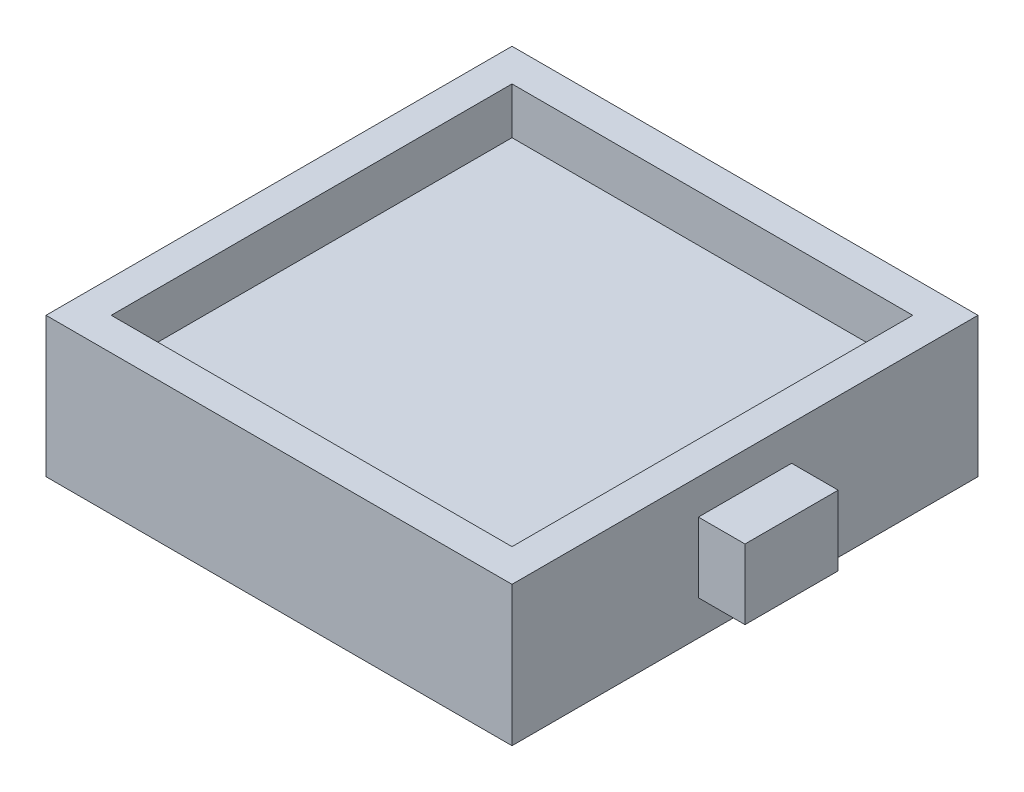
ISO-10303-21;
HEADER;
FILE_DESCRIPTION(('STEP AP214'),'2;1');
FILE_NAME('part.step','',(''),(''),'','','');
FILE_SCHEMA(('AUTOMOTIVE_DESIGN { 1 0 10303 214 1 1 1 1 }'));
ENDSEC;
DATA;
#1=APPLICATION_CONTEXT('core data for automotive mechanical design processes');
#2=APPLICATION_PROTOCOL_DEFINITION('international standard','automotive_design',2000,#1);
#3=PRODUCT_CONTEXT('',#1,'mechanical');
#4=PRODUCT('Part','Part','',(#3));
#5=PRODUCT_RELATED_PRODUCT_CATEGORY('part','',(#4));
#6=PRODUCT_DEFINITION_FORMATION('','',#4);
#7=PRODUCT_DEFINITION_CONTEXT('part definition',#1,'design');
#8=PRODUCT_DEFINITION('design','',#6,#7);
#9=PRODUCT_DEFINITION_SHAPE('','',#8);
#10=(LENGTH_UNIT() NAMED_UNIT(*) SI_UNIT(.MILLI.,.METRE.));
#11=(NAMED_UNIT(*) PLANE_ANGLE_UNIT() SI_UNIT($,.RADIAN.));
#12=(NAMED_UNIT(*) SI_UNIT($,.STERADIAN.) SOLID_ANGLE_UNIT());
#13=UNCERTAINTY_MEASURE_WITH_UNIT(LENGTH_MEASURE(1.E-05),#10,'distance_accuracy_value','');
#14=(GEOMETRIC_REPRESENTATION_CONTEXT(3) GLOBAL_UNCERTAINTY_ASSIGNED_CONTEXT((#13)) GLOBAL_UNIT_ASSIGNED_CONTEXT((#10,
#11,#12)) REPRESENTATION_CONTEXT('',''));
#15=CARTESIAN_POINT('',(0.,0.,0.));
#16=DIRECTION('',(0.,0.,1.));
#17=DIRECTION('',(1.,0.,0.));
#18=AXIS2_PLACEMENT_3D('',#15,#16,#17);
#19=CARTESIAN_POINT('',(50.,-30.,-50.));
#20=DIRECTION('',(1.,0.,0.));
#21=DIRECTION('',(0.,0.,-1.));
#22=AXIS2_PLACEMENT_3D('',#19,#20,#21);
#23=PLANE('',#22);
#24=DIRECTION('',(0.,0.,-1.));
#25=VECTOR('',#24,1.);
#26=CARTESIAN_POINT('',(50.,0.,-50.));
#27=LINE('',#26,#25);
#28=CARTESIAN_POINT('',(50.,0.,50.));
#29=VERTEX_POINT('',#28);
#30=CARTESIAN_POINT('',(50.,0.,-50.));
#31=VERTEX_POINT('',#30);
#32=EDGE_CURVE('E178',#29,#31,#27,.T.);
#33=ORIENTED_EDGE('',*,*,#32,.F.);
#34=DIRECTION('',(0.,1.,0.));
#35=VECTOR('',#34,1.);
#36=CARTESIAN_POINT('',(50.,-30.,50.));
#37=LINE('',#36,#35);
#38=CARTESIAN_POINT('',(50.,-30.,50.));
#39=VERTEX_POINT('',#38);
#40=EDGE_CURVE('E11',#39,#29,#37,.T.);
#41=ORIENTED_EDGE('',*,*,#40,.F.);
#42=DIRECTION('',(0.,0.,-1.));
#43=VECTOR('',#42,1.);
#44=CARTESIAN_POINT('',(50.,-30.,-50.));
#45=LINE('',#44,#43);
#46=CARTESIAN_POINT('',(50.,-30.,-50.));
#47=VERTEX_POINT('',#46);
#48=EDGE_CURVE('E184',#39,#47,#45,.T.);
#49=ORIENTED_EDGE('',*,*,#48,.T.);
#50=DIRECTION('',(0.,1.,0.));
#51=VECTOR('',#50,1.);
#52=CARTESIAN_POINT('',(50.,-30.,-50.));
#53=LINE('',#52,#51);
#54=EDGE_CURVE('E38',#47,#31,#53,.T.);
#55=ORIENTED_EDGE('',*,*,#54,.T.);
#56=EDGE_LOOP('',(#33,#41,#49,#55));
#57=FACE_BOUND('',#56,.T.);
#58=DIRECTION('',(0.,0.,1.));
#59=VECTOR('',#58,1.);
#60=CARTESIAN_POINT('',(50.,-7.5,9.99999999999999));
#61=LINE('',#60,#59);
#62=CARTESIAN_POINT('',(50.,-7.5,-10.));
#63=VERTEX_POINT('',#62);
#64=CARTESIAN_POINT('',(50.,-7.5,9.99999999999999));
#65=VERTEX_POINT('',#64);
#66=EDGE_CURVE('E373',#63,#65,#61,.T.);
#67=ORIENTED_EDGE('',*,*,#66,.F.);
#68=DIRECTION('',(0.,1.,0.));
#69=VECTOR('',#68,1.);
#70=CARTESIAN_POINT('',(50.,-22.5,-10.));
#71=LINE('',#70,#69);
#72=CARTESIAN_POINT('',(50.,-22.5,-10.));
#73=VERTEX_POINT('',#72);
#74=EDGE_CURVE('E147',#73,#63,#71,.T.);
#75=ORIENTED_EDGE('',*,*,#74,.F.);
#76=DIRECTION('',(0.,0.,-1.));
#77=VECTOR('',#76,1.);
#78=CARTESIAN_POINT('',(50.,-22.5,9.99999999999999));
#79=LINE('',#78,#77);
#80=CARTESIAN_POINT('',(50.,-22.5,9.99999999999999));
#81=VERTEX_POINT('',#80);
#82=EDGE_CURVE('E143',#81,#73,#79,.T.);
#83=ORIENTED_EDGE('',*,*,#82,.F.);
#84=DIRECTION('',(0.,-1.,0.));
#85=VECTOR('',#84,1.);
#86=CARTESIAN_POINT('',(50.,-22.5,9.99999999999999));
#87=LINE('',#86,#85);
#88=EDGE_CURVE('E370',#65,#81,#87,.T.);
#89=ORIENTED_EDGE('',*,*,#88,.F.);
#90=EDGE_LOOP('',(#67,#75,#83,#89));
#91=FACE_BOUND('',#90,.T.);
#92=ADVANCED_FACE('F35',(#57,#91),#23,.T.);
#93=CARTESIAN_POINT('',(-50.,-30.,50.));
#94=DIRECTION('',(0.,0.,1.));
#95=DIRECTION('',(1.,0.,0.));
#96=AXIS2_PLACEMENT_3D('',#93,#94,#95);
#97=PLANE('',#96);
#98=DIRECTION('',(1.,0.,0.));
#99=VECTOR('',#98,1.);
#100=CARTESIAN_POINT('',(-50.,0.,50.));
#101=LINE('',#100,#99);
#102=CARTESIAN_POINT('',(-50.,0.,50.));
#103=VERTEX_POINT('',#102);
#104=EDGE_CURVE('E188',#103,#29,#101,.T.);
#105=ORIENTED_EDGE('',*,*,#104,.F.);
#106=DIRECTION('',(0.,1.,0.));
#107=VECTOR('',#106,1.);
#108=CARTESIAN_POINT('',(-50.,-30.,50.));
#109=LINE('',#108,#107);
#110=CARTESIAN_POINT('',(-50.,-30.,50.));
#111=VERTEX_POINT('',#110);
#112=EDGE_CURVE('E43',#111,#103,#109,.T.);
#113=ORIENTED_EDGE('',*,*,#112,.F.);
#114=DIRECTION('',(1.,0.,0.));
#115=VECTOR('',#114,1.);
#116=CARTESIAN_POINT('',(-50.,-30.,50.));
#117=LINE('',#116,#115);
#118=EDGE_CURVE('E194',#111,#39,#117,.T.);
#119=ORIENTED_EDGE('',*,*,#118,.T.);
#120=ORIENTED_EDGE('',*,*,#40,.T.);
#121=EDGE_LOOP('',(#105,#113,#119,#120));
#122=FACE_BOUND('',#121,.T.);
#123=ADVANCED_FACE('F221',(#122),#97,.T.);
#124=CARTESIAN_POINT('',(-50.,-30.,-50.));
#125=DIRECTION('',(-1.,0.,0.));
#126=DIRECTION('',(0.,0.,1.));
#127=AXIS2_PLACEMENT_3D('',#124,#125,#126);
#128=PLANE('',#127);
#129=DIRECTION('',(0.,0.,1.));
#130=VECTOR('',#129,1.);
#131=CARTESIAN_POINT('',(-50.,0.,-50.));
#132=LINE('',#131,#130);
#133=CARTESIAN_POINT('',(-50.,0.,-50.));
#134=VERTEX_POINT('',#133);
#135=EDGE_CURVE('E202',#134,#103,#132,.T.);
#136=ORIENTED_EDGE('',*,*,#135,.F.);
#137=DIRECTION('',(0.,1.,0.));
#138=VECTOR('',#137,1.);
#139=CARTESIAN_POINT('',(-50.,-30.,-50.));
#140=LINE('',#139,#138);
#141=CARTESIAN_POINT('',(-50.,-30.,-50.));
#142=VERTEX_POINT('',#141);
#143=EDGE_CURVE('E207',#142,#134,#140,.T.);
#144=ORIENTED_EDGE('',*,*,#143,.F.);
#145=DIRECTION('',(0.,0.,1.));
#146=VECTOR('',#145,1.);
#147=CARTESIAN_POINT('',(-50.,-30.,-50.));
#148=LINE('',#147,#146);
#149=EDGE_CURVE('E191',#142,#111,#148,.T.);
#150=ORIENTED_EDGE('',*,*,#149,.T.);
#151=ORIENTED_EDGE('',*,*,#112,.T.);
#152=EDGE_LOOP('',(#136,#144,#150,#151));
#153=FACE_BOUND('',#152,.T.);
#154=ADVANCED_FACE('F227',(#153),#128,.T.);
#155=CARTESIAN_POINT('',(-50.,-30.,-50.));
#156=DIRECTION('',(0.,0.,-1.));
#157=DIRECTION('',(-1.,0.,0.));
#158=AXIS2_PLACEMENT_3D('',#155,#156,#157);
#159=PLANE('',#158);
#160=DIRECTION('',(-1.,0.,0.));
#161=VECTOR('',#160,1.);
#162=CARTESIAN_POINT('',(-50.,0.,-50.));
#163=LINE('',#162,#161);
#164=EDGE_CURVE('E199',#31,#134,#163,.T.);
#165=ORIENTED_EDGE('',*,*,#164,.F.);
#166=ORIENTED_EDGE('',*,*,#54,.F.);
#167=DIRECTION('',(-1.,0.,0.));
#168=VECTOR('',#167,1.);
#169=CARTESIAN_POINT('',(-50.,-30.,-50.));
#170=LINE('',#169,#168);
#171=EDGE_CURVE('E187',#47,#142,#170,.T.);
#172=ORIENTED_EDGE('',*,*,#171,.T.);
#173=ORIENTED_EDGE('',*,*,#143,.T.);
#174=EDGE_LOOP('',(#165,#166,#172,#173));
#175=FACE_BOUND('',#174,.T.);
#176=ADVANCED_FACE('F216',(#175),#159,.T.);
#177=CARTESIAN_POINT('',(0.,-30.,0.));
#178=DIRECTION('',(0.,1.,0.));
#179=DIRECTION('',(0.,0.,1.));
#180=AXIS2_PLACEMENT_3D('',#177,#178,#179);
#181=PLANE('',#180);
#182=ORIENTED_EDGE('',*,*,#48,.F.);
#183=ORIENTED_EDGE('',*,*,#118,.F.);
#184=ORIENTED_EDGE('',*,*,#149,.F.);
#185=ORIENTED_EDGE('',*,*,#171,.F.);
#186=EDGE_LOOP('',(#182,#183,#184,#185));
#187=FACE_BOUND('',#186,.T.);
#188=ADVANCED_FACE('F224',(#187),#181,.F.);
#189=CARTESIAN_POINT('',(0.,0.,0.));
#190=DIRECTION('',(0.,1.,0.));
#191=DIRECTION('',(0.,0.,1.));
#192=AXIS2_PLACEMENT_3D('',#189,#190,#191);
#193=PLANE('',#192);
#194=DIRECTION('',(0.,0.,-1.));
#195=VECTOR('',#194,1.);
#196=CARTESIAN_POINT('',(43.,0.,43.));
#197=LINE('',#196,#195);
#198=CARTESIAN_POINT('',(43.,0.,43.));
#199=VERTEX_POINT('',#198);
#200=CARTESIAN_POINT('',(43.,0.,-43.));
#201=VERTEX_POINT('',#200);
#202=EDGE_CURVE('E59',#199,#201,#197,.T.);
#203=ORIENTED_EDGE('',*,*,#202,.F.);
#204=DIRECTION('',(1.,0.,0.));
#205=VECTOR('',#204,1.);
#206=CARTESIAN_POINT('',(-43.,0.,43.));
#207=LINE('',#206,#205);
#208=CARTESIAN_POINT('',(-43.,0.,43.));
#209=VERTEX_POINT('',#208);
#210=EDGE_CURVE('E159',#209,#199,#207,.T.);
#211=ORIENTED_EDGE('',*,*,#210,.F.);
#212=DIRECTION('',(0.,0.,1.));
#213=VECTOR('',#212,1.);
#214=CARTESIAN_POINT('',(-43.,0.,43.));
#215=LINE('',#214,#213);
#216=CARTESIAN_POINT('',(-43.,0.,-43.));
#217=VERTEX_POINT('',#216);
#218=EDGE_CURVE('E171',#217,#209,#215,.T.);
#219=ORIENTED_EDGE('',*,*,#218,.F.);
#220=DIRECTION('',(-1.,0.,0.));
#221=VECTOR('',#220,1.);
#222=CARTESIAN_POINT('',(-43.,0.,-43.));
#223=LINE('',#222,#221);
#224=EDGE_CURVE('E150',#201,#217,#223,.T.);
#225=ORIENTED_EDGE('',*,*,#224,.F.);
#226=EDGE_LOOP('',(#203,#211,#219,#225));
#227=FACE_BOUND('',#226,.T.);
#228=ORIENTED_EDGE('',*,*,#32,.T.);
#229=ORIENTED_EDGE('',*,*,#164,.T.);
#230=ORIENTED_EDGE('',*,*,#135,.T.);
#231=ORIENTED_EDGE('',*,*,#104,.T.);
#232=EDGE_LOOP('',(#228,#229,#230,#231));
#233=FACE_BOUND('',#232,.T.);
#234=ADVANCED_FACE('F218',(#227,#233),#193,.T.);
#235=CARTESIAN_POINT('',(43.,-10.,43.));
#236=DIRECTION('',(1.,0.,0.));
#237=DIRECTION('',(0.,0.,-1.));
#238=AXIS2_PLACEMENT_3D('',#235,#236,#237);
#239=PLANE('',#238);
#240=ORIENTED_EDGE('',*,*,#202,.T.);
#241=DIRECTION('',(0.,1.,0.));
#242=VECTOR('',#241,1.);
#243=CARTESIAN_POINT('',(43.,-10.,-43.));
#244=LINE('',#243,#242);
#245=CARTESIAN_POINT('',(43.,-10.,-43.));
#246=VERTEX_POINT('',#245);
#247=EDGE_CURVE('E167',#246,#201,#244,.T.);
#248=ORIENTED_EDGE('',*,*,#247,.F.);
#249=DIRECTION('',(0.,0.,-1.));
#250=VECTOR('',#249,1.);
#251=CARTESIAN_POINT('',(43.,-10.,43.));
#252=LINE('',#251,#250);
#253=CARTESIAN_POINT('',(43.,-10.,43.));
#254=VERTEX_POINT('',#253);
#255=EDGE_CURVE('E155',#254,#246,#252,.T.);
#256=ORIENTED_EDGE('',*,*,#255,.F.);
#257=DIRECTION('',(0.,1.,0.));
#258=VECTOR('',#257,1.);
#259=CARTESIAN_POINT('',(43.,-10.,43.));
#260=LINE('',#259,#258);
#261=EDGE_CURVE('E176',#254,#199,#260,.T.);
#262=ORIENTED_EDGE('',*,*,#261,.T.);
#263=EDGE_LOOP('',(#240,#248,#256,#262));
#264=FACE_BOUND('',#263,.T.);
#265=ADVANCED_FACE('F271',(#264),#239,.F.);
#266=CARTESIAN_POINT('',(-43.,-10.,43.));
#267=DIRECTION('',(0.,0.,1.));
#268=DIRECTION('',(1.,0.,0.));
#269=AXIS2_PLACEMENT_3D('',#266,#267,#268);
#270=PLANE('',#269);
#271=ORIENTED_EDGE('',*,*,#210,.T.);
#272=ORIENTED_EDGE('',*,*,#261,.F.);
#273=DIRECTION('',(1.,0.,0.));
#274=VECTOR('',#273,1.);
#275=CARTESIAN_POINT('',(-43.,-10.,43.));
#276=LINE('',#275,#274);
#277=CARTESIAN_POINT('',(-43.,-10.,43.));
#278=VERTEX_POINT('',#277);
#279=EDGE_CURVE('E165',#278,#254,#276,.T.);
#280=ORIENTED_EDGE('',*,*,#279,.F.);
#281=DIRECTION('',(0.,1.,0.));
#282=VECTOR('',#281,1.);
#283=CARTESIAN_POINT('',(-43.,-10.,43.));
#284=LINE('',#283,#282);
#285=EDGE_CURVE('E179',#278,#209,#284,.T.);
#286=ORIENTED_EDGE('',*,*,#285,.T.);
#287=EDGE_LOOP('',(#271,#272,#280,#286));
#288=FACE_BOUND('',#287,.T.);
#289=ADVANCED_FACE('F281',(#288),#270,.F.);
#290=CARTESIAN_POINT('',(-43.,-10.,43.));
#291=DIRECTION('',(-1.,0.,0.));
#292=DIRECTION('',(0.,0.,1.));
#293=AXIS2_PLACEMENT_3D('',#290,#291,#292);
#294=PLANE('',#293);
#295=ORIENTED_EDGE('',*,*,#218,.T.);
#296=ORIENTED_EDGE('',*,*,#285,.F.);
#297=DIRECTION('',(0.,0.,1.));
#298=VECTOR('',#297,1.);
#299=CARTESIAN_POINT('',(-43.,-10.,43.));
#300=LINE('',#299,#298);
#301=CARTESIAN_POINT('',(-43.,-10.,-43.));
#302=VERTEX_POINT('',#301);
#303=EDGE_CURVE('E162',#302,#278,#300,.T.);
#304=ORIENTED_EDGE('',*,*,#303,.F.);
#305=DIRECTION('',(0.,1.,0.));
#306=VECTOR('',#305,1.);
#307=CARTESIAN_POINT('',(-43.,-10.,-43.));
#308=LINE('',#307,#306);
#309=EDGE_CURVE('E181',#302,#217,#308,.T.);
#310=ORIENTED_EDGE('',*,*,#309,.T.);
#311=EDGE_LOOP('',(#295,#296,#304,#310));
#312=FACE_BOUND('',#311,.T.);
#313=ADVANCED_FACE('F290',(#312),#294,.F.);
#314=CARTESIAN_POINT('',(-43.,-10.,-43.));
#315=DIRECTION('',(0.,0.,-1.));
#316=DIRECTION('',(-1.,0.,0.));
#317=AXIS2_PLACEMENT_3D('',#314,#315,#316);
#318=PLANE('',#317);
#319=ORIENTED_EDGE('',*,*,#224,.T.);
#320=ORIENTED_EDGE('',*,*,#309,.F.);
#321=DIRECTION('',(-1.,0.,0.));
#322=VECTOR('',#321,1.);
#323=CARTESIAN_POINT('',(-43.,-10.,-43.));
#324=LINE('',#323,#322);
#325=EDGE_CURVE('E158',#246,#302,#324,.T.);
#326=ORIENTED_EDGE('',*,*,#325,.F.);
#327=ORIENTED_EDGE('',*,*,#247,.T.);
#328=EDGE_LOOP('',(#319,#320,#326,#327));
#329=FACE_BOUND('',#328,.T.);
#330=ADVANCED_FACE('F300',(#329),#318,.F.);
#331=CARTESIAN_POINT('',(0.,-10.,0.));
#332=DIRECTION('',(0.,-1.,0.));
#333=DIRECTION('',(0.,0.,-1.));
#334=AXIS2_PLACEMENT_3D('',#331,#332,#333);
#335=PLANE('',#334);
#336=ORIENTED_EDGE('',*,*,#255,.T.);
#337=ORIENTED_EDGE('',*,*,#325,.T.);
#338=ORIENTED_EDGE('',*,*,#303,.T.);
#339=ORIENTED_EDGE('',*,*,#279,.T.);
#340=EDGE_LOOP('',(#336,#337,#338,#339));
#341=FACE_BOUND('',#340,.T.);
#342=ADVANCED_FACE('F309',(#341),#335,.F.);
#343=CARTESIAN_POINT('',(60.,-22.5,-10.));
#344=DIRECTION('',(0.,0.,1.));
#345=DIRECTION('',(1.,0.,0.));
#346=AXIS2_PLACEMENT_3D('',#343,#344,#345);
#347=PLANE('',#346);
#348=ORIENTED_EDGE('',*,*,#74,.T.);
#349=DIRECTION('',(-1.,0.,0.));
#350=VECTOR('',#349,1.);
#351=CARTESIAN_POINT('',(60.,-7.5,-10.));
#352=LINE('',#351,#350);
#353=CARTESIAN_POINT('',(60.,-7.5,-10.));
#354=VERTEX_POINT('',#353);
#355=EDGE_CURVE('E128',#354,#63,#352,.T.);
#356=ORIENTED_EDGE('',*,*,#355,.F.);
#357=DIRECTION('',(0.,1.,0.));
#358=VECTOR('',#357,1.);
#359=CARTESIAN_POINT('',(60.,-22.5,-10.));
#360=LINE('',#359,#358);
#361=CARTESIAN_POINT('',(60.,-22.5,-10.));
#362=VERTEX_POINT('',#361);
#363=EDGE_CURVE('E135',#362,#354,#360,.T.);
#364=ORIENTED_EDGE('',*,*,#363,.F.);
#365=DIRECTION('',(-1.,0.,0.));
#366=VECTOR('',#365,1.);
#367=CARTESIAN_POINT('',(60.,-22.5,-10.));
#368=LINE('',#367,#366);
#369=EDGE_CURVE('E368',#362,#73,#368,.T.);
#370=ORIENTED_EDGE('',*,*,#369,.T.);
#371=EDGE_LOOP('',(#348,#356,#364,#370));
#372=FACE_BOUND('',#371,.T.);
#373=ADVANCED_FACE('F145',(#372),#347,.F.);
#374=CARTESIAN_POINT('',(60.,-7.5,9.99999999999999));
#375=DIRECTION('',(0.,-1.,0.));
#376=DIRECTION('',(0.,0.,-1.));
#377=AXIS2_PLACEMENT_3D('',#374,#375,#376);
#378=PLANE('',#377);
#379=ORIENTED_EDGE('',*,*,#66,.T.);
#380=DIRECTION('',(-1.,0.,0.));
#381=VECTOR('',#380,1.);
#382=CARTESIAN_POINT('',(60.,-7.5,9.99999999999999));
#383=LINE('',#382,#381);
#384=CARTESIAN_POINT('',(60.,-7.5,9.99999999999999));
#385=VERTEX_POINT('',#384);
#386=EDGE_CURVE('E131',#385,#65,#383,.T.);
#387=ORIENTED_EDGE('',*,*,#386,.F.);
#388=DIRECTION('',(0.,0.,1.));
#389=VECTOR('',#388,1.);
#390=CARTESIAN_POINT('',(60.,-7.5,9.99999999999999));
#391=LINE('',#390,#389);
#392=EDGE_CURVE('E124',#354,#385,#391,.T.);
#393=ORIENTED_EDGE('',*,*,#392,.F.);
#394=ORIENTED_EDGE('',*,*,#355,.T.);
#395=EDGE_LOOP('',(#379,#387,#393,#394));
#396=FACE_BOUND('',#395,.T.);
#397=ADVANCED_FACE('F126',(#396),#378,.F.);
#398=CARTESIAN_POINT('',(60.,-22.5,9.99999999999999));
#399=DIRECTION('',(0.,0.,-1.));
#400=DIRECTION('',(-1.,0.,0.));
#401=AXIS2_PLACEMENT_3D('',#398,#399,#400);
#402=PLANE('',#401);
#403=ORIENTED_EDGE('',*,*,#88,.T.);
#404=DIRECTION('',(-1.,0.,0.));
#405=VECTOR('',#404,1.);
#406=CARTESIAN_POINT('',(60.,-22.5,9.99999999999999));
#407=LINE('',#406,#405);
#408=CARTESIAN_POINT('',(60.,-22.5,9.99999999999999));
#409=VERTEX_POINT('',#408);
#410=EDGE_CURVE('E51',#409,#81,#407,.T.);
#411=ORIENTED_EDGE('',*,*,#410,.F.);
#412=DIRECTION('',(0.,-1.,0.));
#413=VECTOR('',#412,1.);
#414=CARTESIAN_POINT('',(60.,-22.5,9.99999999999999));
#415=LINE('',#414,#413);
#416=EDGE_CURVE('E134',#385,#409,#415,.T.);
#417=ORIENTED_EDGE('',*,*,#416,.F.);
#418=ORIENTED_EDGE('',*,*,#386,.T.);
#419=EDGE_LOOP('',(#403,#411,#417,#418));
#420=FACE_BOUND('',#419,.T.);
#421=ADVANCED_FACE('F332',(#420),#402,.F.);
#422=CARTESIAN_POINT('',(60.,-22.5,9.99999999999999));
#423=DIRECTION('',(0.,1.,0.));
#424=DIRECTION('',(0.,0.,1.));
#425=AXIS2_PLACEMENT_3D('',#422,#423,#424);
#426=PLANE('',#425);
#427=ORIENTED_EDGE('',*,*,#82,.T.);
#428=ORIENTED_EDGE('',*,*,#369,.F.);
#429=DIRECTION('',(0.,0.,-1.));
#430=VECTOR('',#429,1.);
#431=CARTESIAN_POINT('',(60.,-22.5,9.99999999999999));
#432=LINE('',#431,#430);
#433=EDGE_CURVE('E139',#409,#362,#432,.T.);
#434=ORIENTED_EDGE('',*,*,#433,.F.);
#435=ORIENTED_EDGE('',*,*,#410,.T.);
#436=EDGE_LOOP('',(#427,#428,#434,#435));
#437=FACE_BOUND('',#436,.T.);
#438=ADVANCED_FACE('F339',(#437),#426,.F.);
#439=CARTESIAN_POINT('',(60.,0.,0.));
#440=DIRECTION('',(-1.,0.,0.));
#441=DIRECTION('',(0.,0.,1.));
#442=AXIS2_PLACEMENT_3D('',#439,#440,#441);
#443=PLANE('',#442);
#444=ORIENTED_EDGE('',*,*,#363,.T.);
#445=ORIENTED_EDGE('',*,*,#392,.T.);
#446=ORIENTED_EDGE('',*,*,#416,.T.);
#447=ORIENTED_EDGE('',*,*,#433,.T.);
#448=EDGE_LOOP('',(#444,#445,#446,#447));
#449=FACE_BOUND('',#448,.T.);
#450=ADVANCED_FACE('F138',(#449),#443,.F.);
#451=CLOSED_SHELL('',(#92,#123,#154,#176,#188,#234,#265,#289,#313,#330,#342,#373,#397,#421,#438,#450));
#452=MANIFOLD_SOLID_BREP('B2',#451);
#453=ADVANCED_BREP_SHAPE_REPRESENTATION('',(#18,#452),#14);
#454=SHAPE_DEFINITION_REPRESENTATION(#9,#453);
ENDSEC;
END-ISO-10303-21;
